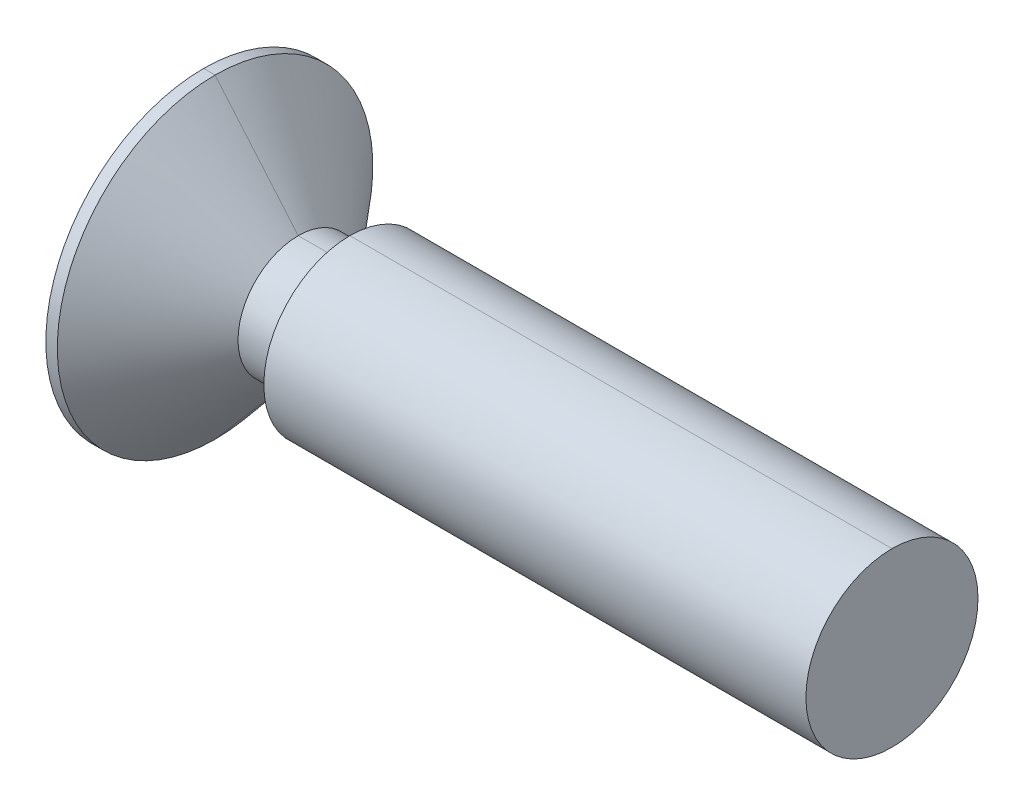
ISO-10303-21;
HEADER;
FILE_DESCRIPTION(('STEP AP214'),'2;1');
FILE_NAME('part.step','',(''),(''),'','','');
FILE_SCHEMA(('AUTOMOTIVE_DESIGN { 1 0 10303 214 1 1 1 1 }'));
ENDSEC;
DATA;
#1=APPLICATION_CONTEXT('core data for automotive mechanical design processes');
#2=APPLICATION_PROTOCOL_DEFINITION('international standard','automotive_design',2000,#1);
#3=PRODUCT_CONTEXT('',#1,'mechanical');
#4=PRODUCT('Part','Part','',(#3));
#5=PRODUCT_RELATED_PRODUCT_CATEGORY('part','',(#4));
#6=PRODUCT_DEFINITION_FORMATION('','',#4);
#7=PRODUCT_DEFINITION_CONTEXT('part definition',#1,'design');
#8=PRODUCT_DEFINITION('design','',#6,#7);
#9=PRODUCT_DEFINITION_SHAPE('','',#8);
#10=(LENGTH_UNIT() NAMED_UNIT(*) SI_UNIT(.MILLI.,.METRE.));
#11=(NAMED_UNIT(*) PLANE_ANGLE_UNIT() SI_UNIT($,.RADIAN.));
#12=(NAMED_UNIT(*) SI_UNIT($,.STERADIAN.) SOLID_ANGLE_UNIT());
#13=UNCERTAINTY_MEASURE_WITH_UNIT(LENGTH_MEASURE(1.E-05),#10,'distance_accuracy_value','');
#14=(GEOMETRIC_REPRESENTATION_CONTEXT(3) GLOBAL_UNCERTAINTY_ASSIGNED_CONTEXT((#13)) GLOBAL_UNIT_ASSIGNED_CONTEXT((#10,
#11,#12)) REPRESENTATION_CONTEXT('',''));
#15=CARTESIAN_POINT('',(0.,0.,0.));
#16=DIRECTION('',(0.,0.,1.));
#17=DIRECTION('',(1.,0.,0.));
#18=AXIS2_PLACEMENT_3D('',#15,#16,#17);
#19=CARTESIAN_POINT('',(-11.175,0.675,-0.675));
#20=DIRECTION('',(1.,0.,0.));
#21=DIRECTION('',(0.,1.,0.));
#22=AXIS2_PLACEMENT_3D('',#19,#20,#21);
#23=PLANE('',#22);
#24=DIRECTION('',(0.,-1.,0.));
#25=VECTOR('',#24,1.);
#26=CARTESIAN_POINT('',(-11.175,1.8,-0.375));
#27=LINE('',#26,#25);
#28=CARTESIAN_POINT('',(-11.175,1.8,-0.375));
#29=VERTEX_POINT('',#28);
#30=CARTESIAN_POINT('',(-11.175,0.675,-0.375));
#31=VERTEX_POINT('',#30);
#32=EDGE_CURVE('E304',#29,#31,#27,.T.);
#33=ORIENTED_EDGE('',*,*,#32,.T.);
#34=CARTESIAN_POINT('',(-11.175,0.675,-0.675));
#35=DIRECTION('',(1.,0.,0.));
#36=DIRECTION('',(0.,1.,0.));
#37=AXIS2_PLACEMENT_3D('',#34,#35,#36);
#38=CIRCLE('',#37,0.3);
#39=CARTESIAN_POINT('',(-11.175,0.375,-0.675));
#40=VERTEX_POINT('',#39);
#41=EDGE_CURVE('E10',#31,#40,#38,.T.);
#42=ORIENTED_EDGE('',*,*,#41,.T.);
#43=DIRECTION('',(0.,0.,-1.));
#44=VECTOR('',#43,1.);
#45=CARTESIAN_POINT('',(-11.175,0.375,-1.8));
#46=LINE('',#45,#44);
#47=CARTESIAN_POINT('',(-11.175,0.375,-1.8));
#48=VERTEX_POINT('',#47);
#49=EDGE_CURVE('E208',#40,#48,#46,.T.);
#50=ORIENTED_EDGE('',*,*,#49,.T.);
#51=DIRECTION('',(0.,-1.,0.));
#52=VECTOR('',#51,1.);
#53=CARTESIAN_POINT('',(-11.175,0.375,-1.8));
#54=LINE('',#53,#52);
#55=CARTESIAN_POINT('',(-11.175,-0.375,-1.8));
#56=VERTEX_POINT('',#55);
#57=EDGE_CURVE('E201',#48,#56,#54,.T.);
#58=ORIENTED_EDGE('',*,*,#57,.T.);
#59=DIRECTION('',(0.,0.,1.));
#60=VECTOR('',#59,1.);
#61=CARTESIAN_POINT('',(-11.175,-0.375,-1.8));
#62=LINE('',#61,#60);
#63=CARTESIAN_POINT('',(-11.175,-0.375,-0.675));
#64=VERTEX_POINT('',#63);
#65=EDGE_CURVE('E205',#56,#64,#62,.T.);
#66=ORIENTED_EDGE('',*,*,#65,.T.);
#67=CARTESIAN_POINT('',(-11.175,-0.675,-0.675));
#68=DIRECTION('',(1.,0.,0.));
#69=DIRECTION('',(0.,-1.,0.));
#70=AXIS2_PLACEMENT_3D('',#67,#68,#69);
#71=CIRCLE('',#70,0.3);
#72=CARTESIAN_POINT('',(-11.175,-0.675,-0.375));
#73=VERTEX_POINT('',#72);
#74=EDGE_CURVE('E234',#64,#73,#71,.T.);
#75=ORIENTED_EDGE('',*,*,#74,.T.);
#76=DIRECTION('',(0.,-1.,0.));
#77=VECTOR('',#76,1.);
#78=CARTESIAN_POINT('',(-11.175,-0.675,-0.375));
#79=LINE('',#78,#77);
#80=CARTESIAN_POINT('',(-11.175,-1.8,-0.375));
#81=VERTEX_POINT('',#80);
#82=EDGE_CURVE('E286',#73,#81,#79,.T.);
#83=ORIENTED_EDGE('',*,*,#82,.T.);
#84=DIRECTION('',(0.,0.,1.));
#85=VECTOR('',#84,1.);
#86=CARTESIAN_POINT('',(-11.175,-1.8,-0.375));
#87=LINE('',#86,#85);
#88=CARTESIAN_POINT('',(-11.175,-1.8,0.375));
#89=VERTEX_POINT('',#88);
#90=EDGE_CURVE('E287',#81,#89,#87,.T.);
#91=ORIENTED_EDGE('',*,*,#90,.T.);
#92=DIRECTION('',(0.,1.,0.));
#93=VECTOR('',#92,1.);
#94=CARTESIAN_POINT('',(-11.175,-0.675,0.375));
#95=LINE('',#94,#93);
#96=CARTESIAN_POINT('',(-11.175,-0.675,0.375));
#97=VERTEX_POINT('',#96);
#98=EDGE_CURVE('E279',#89,#97,#95,.T.);
#99=ORIENTED_EDGE('',*,*,#98,.T.);
#100=CARTESIAN_POINT('',(-11.175,-0.675,0.675));
#101=DIRECTION('',(1.,0.,0.));
#102=DIRECTION('',(0.,1.,0.));
#103=AXIS2_PLACEMENT_3D('',#100,#101,#102);
#104=CIRCLE('',#103,0.3);
#105=CARTESIAN_POINT('',(-11.175,-0.375,0.675));
#106=VERTEX_POINT('',#105);
#107=EDGE_CURVE('E266',#97,#106,#104,.T.);
#108=ORIENTED_EDGE('',*,*,#107,.T.);
#109=DIRECTION('',(0.,0.,1.));
#110=VECTOR('',#109,1.);
#111=CARTESIAN_POINT('',(-11.175,-0.375,0.675));
#112=LINE('',#111,#110);
#113=CARTESIAN_POINT('',(-11.175,-0.375,1.8));
#114=VERTEX_POINT('',#113);
#115=EDGE_CURVE('E383',#106,#114,#112,.T.);
#116=ORIENTED_EDGE('',*,*,#115,.T.);
#117=DIRECTION('',(0.,1.,0.));
#118=VECTOR('',#117,1.);
#119=CARTESIAN_POINT('',(-11.175,0.375,1.8));
#120=LINE('',#119,#118);
#121=CARTESIAN_POINT('',(-11.175,0.375,1.8));
#122=VERTEX_POINT('',#121);
#123=EDGE_CURVE('E299',#114,#122,#120,.T.);
#124=ORIENTED_EDGE('',*,*,#123,.T.);
#125=DIRECTION('',(0.,0.,-1.));
#126=VECTOR('',#125,1.);
#127=CARTESIAN_POINT('',(-11.175,0.375,0.675));
#128=LINE('',#127,#126);
#129=CARTESIAN_POINT('',(-11.175,0.375,0.675));
#130=VERTEX_POINT('',#129);
#131=EDGE_CURVE('E300',#122,#130,#128,.T.);
#132=ORIENTED_EDGE('',*,*,#131,.T.);
#133=CARTESIAN_POINT('',(-11.175,0.675,0.675));
#134=DIRECTION('',(1.,0.,0.));
#135=DIRECTION('',(0.,1.,0.));
#136=AXIS2_PLACEMENT_3D('',#133,#134,#135);
#137=CIRCLE('',#136,0.3);
#138=CARTESIAN_POINT('',(-11.175,0.675,0.375));
#139=VERTEX_POINT('',#138);
#140=EDGE_CURVE('E240',#130,#139,#137,.T.);
#141=ORIENTED_EDGE('',*,*,#140,.T.);
#142=DIRECTION('',(0.,1.,0.));
#143=VECTOR('',#142,1.);
#144=CARTESIAN_POINT('',(-11.175,1.8,0.375));
#145=LINE('',#144,#143);
#146=CARTESIAN_POINT('',(-11.175,1.8,0.375));
#147=VERTEX_POINT('',#146);
#148=EDGE_CURVE('E273',#139,#147,#145,.T.);
#149=ORIENTED_EDGE('',*,*,#148,.T.);
#150=DIRECTION('',(0.,0.,-1.));
#151=VECTOR('',#150,1.);
#152=CARTESIAN_POINT('',(-11.175,1.8,-0.375));
#153=LINE('',#152,#151);
#154=EDGE_CURVE('E274',#147,#29,#153,.T.);
#155=ORIENTED_EDGE('',*,*,#154,.T.);
#156=EDGE_LOOP('',(#33,#42,#50,#58,#66,#75,#83,#91,#99,#108,#116,#124,#132,#141,#149,#155));
#157=FACE_BOUND('',#156,.T.);
#158=ADVANCED_FACE('F16',(#157),#23,.F.);
#159=CARTESIAN_POINT('',(-11.175,0.675,-0.675));
#160=DIRECTION('',(-1.,0.,0.));
#161=DIRECTION('',(0.,-1.,0.));
#162=AXIS2_PLACEMENT_3D('',#159,#160,#161);
#163=CYLINDRICAL_SURFACE('',#162,0.3);
#164=CARTESIAN_POINT('',(-12.,0.675,-0.675));
#165=DIRECTION('',(1.,0.,0.));
#166=DIRECTION('',(0.,1.,0.));
#167=AXIS2_PLACEMENT_3D('',#164,#165,#166);
#168=CIRCLE('',#167,0.3);
#169=CARTESIAN_POINT('',(-12.,0.675,-0.375));
#170=VERTEX_POINT('',#169);
#171=CARTESIAN_POINT('',(-12.,0.375,-0.675));
#172=VERTEX_POINT('',#171);
#173=EDGE_CURVE('E294',#170,#172,#168,.T.);
#174=ORIENTED_EDGE('',*,*,#173,.T.);
#175=DIRECTION('',(-1.,0.,0.));
#176=VECTOR('',#175,1.);
#177=CARTESIAN_POINT('',(-11.175,0.375,-0.675));
#178=LINE('',#177,#176);
#179=EDGE_CURVE('E27',#40,#172,#178,.T.);
#180=ORIENTED_EDGE('',*,*,#179,.F.);
#181=ORIENTED_EDGE('',*,*,#41,.F.);
#182=DIRECTION('',(-1.,0.,0.));
#183=VECTOR('',#182,1.);
#184=CARTESIAN_POINT('',(-11.175,0.675,-0.375));
#185=LINE('',#184,#183);
#186=EDGE_CURVE('E307',#31,#170,#185,.T.);
#187=ORIENTED_EDGE('',*,*,#186,.T.);
#188=EDGE_LOOP('',(#174,#180,#181,#187));
#189=FACE_BOUND('',#188,.T.);
#190=ADVANCED_FACE('F661',(#189),#163,.T.);
#191=CARTESIAN_POINT('',(-11.175,0.375,-1.8));
#192=DIRECTION('',(0.,1.,0.));
#193=DIRECTION('',(1.,0.,0.));
#194=AXIS2_PLACEMENT_3D('',#191,#192,#193);
#195=PLANE('',#194);
#196=DIRECTION('',(0.,0.,-1.));
#197=VECTOR('',#196,1.);
#198=CARTESIAN_POINT('',(-12.,0.375,-1.8));
#199=LINE('',#198,#197);
#200=CARTESIAN_POINT('',(-12.,0.375,-1.8));
#201=VERTEX_POINT('',#200);
#202=EDGE_CURVE('E291',#172,#201,#199,.T.);
#203=ORIENTED_EDGE('',*,*,#202,.T.);
#204=DIRECTION('',(-1.,0.,0.));
#205=VECTOR('',#204,1.);
#206=CARTESIAN_POINT('',(-11.175,0.375,-1.8));
#207=LINE('',#206,#205);
#208=EDGE_CURVE('E212',#48,#201,#207,.T.);
#209=ORIENTED_EDGE('',*,*,#208,.F.);
#210=ORIENTED_EDGE('',*,*,#49,.F.);
#211=ORIENTED_EDGE('',*,*,#179,.T.);
#212=EDGE_LOOP('',(#203,#209,#210,#211));
#213=FACE_BOUND('',#212,.T.);
#214=ADVANCED_FACE('F704',(#213),#195,.F.);
#215=CARTESIAN_POINT('',(-11.175,0.375,-1.8));
#216=DIRECTION('',(0.,0.,-1.));
#217=DIRECTION('',(0.,-1.,0.));
#218=AXIS2_PLACEMENT_3D('',#215,#216,#217);
#219=PLANE('',#218);
#220=DIRECTION('',(0.,-1.,0.));
#221=VECTOR('',#220,1.);
#222=CARTESIAN_POINT('',(-12.,0.375,-1.8));
#223=LINE('',#222,#221);
#224=CARTESIAN_POINT('',(-12.,-0.375,-1.8));
#225=VERTEX_POINT('',#224);
#226=EDGE_CURVE('E219',#201,#225,#223,.T.);
#227=ORIENTED_EDGE('',*,*,#226,.T.);
#228=DIRECTION('',(-1.,0.,0.));
#229=VECTOR('',#228,1.);
#230=CARTESIAN_POINT('',(-11.175,-0.375,-1.8));
#231=LINE('',#230,#229);
#232=EDGE_CURVE('E213',#56,#225,#231,.T.);
#233=ORIENTED_EDGE('',*,*,#232,.F.);
#234=ORIENTED_EDGE('',*,*,#57,.F.);
#235=ORIENTED_EDGE('',*,*,#208,.T.);
#236=EDGE_LOOP('',(#227,#233,#234,#235));
#237=FACE_BOUND('',#236,.T.);
#238=ADVANCED_FACE('F217',(#237),#219,.F.);
#239=CARTESIAN_POINT('',(-11.175,-0.375,-1.8));
#240=DIRECTION('',(0.,-1.,0.));
#241=DIRECTION('',(0.,0.,-1.));
#242=AXIS2_PLACEMENT_3D('',#239,#240,#241);
#243=PLANE('',#242);
#244=DIRECTION('',(0.,0.,1.));
#245=VECTOR('',#244,1.);
#246=CARTESIAN_POINT('',(-12.,-0.375,-1.8));
#247=LINE('',#246,#245);
#248=CARTESIAN_POINT('',(-12.,-0.375,-0.675));
#249=VERTEX_POINT('',#248);
#250=EDGE_CURVE('E340',#225,#249,#247,.T.);
#251=ORIENTED_EDGE('',*,*,#250,.T.);
#252=DIRECTION('',(-1.,0.,0.));
#253=VECTOR('',#252,1.);
#254=CARTESIAN_POINT('',(-11.175,-0.375,-0.675));
#255=LINE('',#254,#253);
#256=EDGE_CURVE('E226',#64,#249,#255,.T.);
#257=ORIENTED_EDGE('',*,*,#256,.F.);
#258=ORIENTED_EDGE('',*,*,#65,.F.);
#259=ORIENTED_EDGE('',*,*,#232,.T.);
#260=EDGE_LOOP('',(#251,#257,#258,#259));
#261=FACE_BOUND('',#260,.T.);
#262=ADVANCED_FACE('F225',(#261),#243,.F.);
#263=CARTESIAN_POINT('',(-11.175,-0.675,-0.675));
#264=DIRECTION('',(-1.,0.,0.));
#265=DIRECTION('',(0.,-1.,0.));
#266=AXIS2_PLACEMENT_3D('',#263,#264,#265);
#267=CYLINDRICAL_SURFACE('',#266,0.3);
#268=CARTESIAN_POINT('',(-12.,-0.675,-0.675));
#269=DIRECTION('',(1.,0.,0.));
#270=DIRECTION('',(0.,-1.,0.));
#271=AXIS2_PLACEMENT_3D('',#268,#269,#270);
#272=CIRCLE('',#271,0.3);
#273=CARTESIAN_POINT('',(-12.,-0.675,-0.375));
#274=VERTEX_POINT('',#273);
#275=EDGE_CURVE('E337',#249,#274,#272,.T.);
#276=ORIENTED_EDGE('',*,*,#275,.T.);
#277=DIRECTION('',(-1.,0.,0.));
#278=VECTOR('',#277,1.);
#279=CARTESIAN_POINT('',(-11.175,-0.675,-0.375));
#280=LINE('',#279,#278);
#281=EDGE_CURVE('E290',#73,#274,#280,.T.);
#282=ORIENTED_EDGE('',*,*,#281,.F.);
#283=ORIENTED_EDGE('',*,*,#74,.F.);
#284=ORIENTED_EDGE('',*,*,#256,.T.);
#285=EDGE_LOOP('',(#276,#282,#283,#284));
#286=FACE_BOUND('',#285,.T.);
#287=ADVANCED_FACE('F625',(#286),#267,.T.);
#288=CARTESIAN_POINT('',(-11.175,-0.675,-0.375));
#289=DIRECTION('',(0.,0.,-1.));
#290=DIRECTION('',(0.,-1.,0.));
#291=AXIS2_PLACEMENT_3D('',#288,#289,#290);
#292=PLANE('',#291);
#293=DIRECTION('',(0.,-1.,0.));
#294=VECTOR('',#293,1.);
#295=CARTESIAN_POINT('',(-12.,-0.675,-0.375));
#296=LINE('',#295,#294);
#297=CARTESIAN_POINT('',(-12.,-1.8,-0.375));
#298=VERTEX_POINT('',#297);
#299=EDGE_CURVE('E341',#274,#298,#296,.T.);
#300=ORIENTED_EDGE('',*,*,#299,.T.);
#301=DIRECTION('',(-1.,0.,0.));
#302=VECTOR('',#301,1.);
#303=CARTESIAN_POINT('',(-11.175,-1.8,-0.375));
#304=LINE('',#303,#302);
#305=EDGE_CURVE('E283',#81,#298,#304,.T.);
#306=ORIENTED_EDGE('',*,*,#305,.F.);
#307=ORIENTED_EDGE('',*,*,#82,.F.);
#308=ORIENTED_EDGE('',*,*,#281,.T.);
#309=EDGE_LOOP('',(#300,#306,#307,#308));
#310=FACE_BOUND('',#309,.T.);
#311=ADVANCED_FACE('F620',(#310),#292,.F.);
#312=CARTESIAN_POINT('',(-11.175,-1.8,-0.375));
#313=DIRECTION('',(0.,-1.,0.));
#314=DIRECTION('',(0.,0.,-1.));
#315=AXIS2_PLACEMENT_3D('',#312,#313,#314);
#316=PLANE('',#315);
#317=DIRECTION('',(0.,0.,1.));
#318=VECTOR('',#317,1.);
#319=CARTESIAN_POINT('',(-12.,-1.8,-0.375));
#320=LINE('',#319,#318);
#321=CARTESIAN_POINT('',(-12.,-1.8,0.375));
#322=VERTEX_POINT('',#321);
#323=EDGE_CURVE('E352',#298,#322,#320,.T.);
#324=ORIENTED_EDGE('',*,*,#323,.T.);
#325=DIRECTION('',(-1.,0.,0.));
#326=VECTOR('',#325,1.);
#327=CARTESIAN_POINT('',(-11.175,-1.8,0.375));
#328=LINE('',#327,#326);
#329=EDGE_CURVE('E370',#89,#322,#328,.T.);
#330=ORIENTED_EDGE('',*,*,#329,.F.);
#331=ORIENTED_EDGE('',*,*,#90,.F.);
#332=ORIENTED_EDGE('',*,*,#305,.T.);
#333=EDGE_LOOP('',(#324,#330,#331,#332));
#334=FACE_BOUND('',#333,.T.);
#335=ADVANCED_FACE('F624',(#334),#316,.F.);
#336=CARTESIAN_POINT('',(-11.175,-0.675,0.375));
#337=DIRECTION('',(0.,0.,1.));
#338=DIRECTION('',(0.,-1.,0.));
#339=AXIS2_PLACEMENT_3D('',#336,#337,#338);
#340=PLANE('',#339);
#341=DIRECTION('',(0.,1.,0.));
#342=VECTOR('',#341,1.);
#343=CARTESIAN_POINT('',(-12.,-0.675,0.375));
#344=LINE('',#343,#342);
#345=CARTESIAN_POINT('',(-12.,-0.675,0.375));
#346=VERTEX_POINT('',#345);
#347=EDGE_CURVE('E363',#322,#346,#344,.T.);
#348=ORIENTED_EDGE('',*,*,#347,.T.);
#349=DIRECTION('',(-1.,0.,0.));
#350=VECTOR('',#349,1.);
#351=CARTESIAN_POINT('',(-11.175,-0.675,0.375));
#352=LINE('',#351,#350);
#353=EDGE_CURVE('E269',#97,#346,#352,.T.);
#354=ORIENTED_EDGE('',*,*,#353,.F.);
#355=ORIENTED_EDGE('',*,*,#98,.F.);
#356=ORIENTED_EDGE('',*,*,#329,.T.);
#357=EDGE_LOOP('',(#348,#354,#355,#356));
#358=FACE_BOUND('',#357,.T.);
#359=ADVANCED_FACE('F688',(#358),#340,.F.);
#360=CARTESIAN_POINT('',(-11.175,-0.675,0.675));
#361=DIRECTION('',(-1.,0.,0.));
#362=DIRECTION('',(0.,-1.,0.));
#363=AXIS2_PLACEMENT_3D('',#360,#361,#362);
#364=CYLINDRICAL_SURFACE('',#363,0.3);
#365=CARTESIAN_POINT('',(-12.,-0.675,0.675));
#366=DIRECTION('',(1.,0.,0.));
#367=DIRECTION('',(0.,1.,0.));
#368=AXIS2_PLACEMENT_3D('',#365,#366,#367);
#369=CIRCLE('',#368,0.3);
#370=CARTESIAN_POINT('',(-12.,-0.375,0.675));
#371=VERTEX_POINT('',#370);
#372=EDGE_CURVE('E372',#346,#371,#369,.T.);
#373=ORIENTED_EDGE('',*,*,#372,.T.);
#374=DIRECTION('',(-1.,0.,0.));
#375=VECTOR('',#374,1.);
#376=CARTESIAN_POINT('',(-11.175,-0.375,0.675));
#377=LINE('',#376,#375);
#378=EDGE_CURVE('E270',#106,#371,#377,.T.);
#379=ORIENTED_EDGE('',*,*,#378,.F.);
#380=ORIENTED_EDGE('',*,*,#107,.F.);
#381=ORIENTED_EDGE('',*,*,#353,.T.);
#382=EDGE_LOOP('',(#373,#379,#380,#381));
#383=FACE_BOUND('',#382,.T.);
#384=ADVANCED_FACE('F684',(#383),#364,.T.);
#385=CARTESIAN_POINT('',(-11.175,-0.375,0.675));
#386=DIRECTION('',(0.,-1.,0.));
#387=DIRECTION('',(0.,0.,-1.));
#388=AXIS2_PLACEMENT_3D('',#385,#386,#387);
#389=PLANE('',#388);
#390=DIRECTION('',(0.,0.,1.));
#391=VECTOR('',#390,1.);
#392=CARTESIAN_POINT('',(-12.,-0.375,0.675));
#393=LINE('',#392,#391);
#394=CARTESIAN_POINT('',(-12.,-0.375,1.8));
#395=VERTEX_POINT('',#394);
#396=EDGE_CURVE('E20',#371,#395,#393,.T.);
#397=ORIENTED_EDGE('',*,*,#396,.T.);
#398=DIRECTION('',(-1.,0.,0.));
#399=VECTOR('',#398,1.);
#400=CARTESIAN_POINT('',(-11.175,-0.375,1.8));
#401=LINE('',#400,#399);
#402=EDGE_CURVE('E386',#114,#395,#401,.T.);
#403=ORIENTED_EDGE('',*,*,#402,.F.);
#404=ORIENTED_EDGE('',*,*,#115,.F.);
#405=ORIENTED_EDGE('',*,*,#378,.T.);
#406=EDGE_LOOP('',(#397,#403,#404,#405));
#407=FACE_BOUND('',#406,.T.);
#408=ADVANCED_FACE('F18',(#407),#389,.F.);
#409=CARTESIAN_POINT('',(-11.175,0.375,1.8));
#410=DIRECTION('',(0.,0.,1.));
#411=DIRECTION('',(1.,0.,0.));
#412=AXIS2_PLACEMENT_3D('',#409,#410,#411);
#413=PLANE('',#412);
#414=DIRECTION('',(0.,1.,0.));
#415=VECTOR('',#414,1.);
#416=CARTESIAN_POINT('',(-12.,0.375,1.8));
#417=LINE('',#416,#415);
#418=CARTESIAN_POINT('',(-12.,0.375,1.8));
#419=VERTEX_POINT('',#418);
#420=EDGE_CURVE('E333',#395,#419,#417,.T.);
#421=ORIENTED_EDGE('',*,*,#420,.T.);
#422=DIRECTION('',(-1.,0.,0.));
#423=VECTOR('',#422,1.);
#424=CARTESIAN_POINT('',(-11.175,0.375,1.8));
#425=LINE('',#424,#423);
#426=EDGE_CURVE('E296',#122,#419,#425,.T.);
#427=ORIENTED_EDGE('',*,*,#426,.F.);
#428=ORIENTED_EDGE('',*,*,#123,.F.);
#429=ORIENTED_EDGE('',*,*,#402,.T.);
#430=EDGE_LOOP('',(#421,#427,#428,#429));
#431=FACE_BOUND('',#430,.T.);
#432=ADVANCED_FACE('F640',(#431),#413,.F.);
#433=CARTESIAN_POINT('',(-11.175,0.375,0.675));
#434=DIRECTION('',(0.,1.,0.));
#435=DIRECTION('',(0.,0.,-1.));
#436=AXIS2_PLACEMENT_3D('',#433,#434,#435);
#437=PLANE('',#436);
#438=DIRECTION('',(0.,0.,-1.));
#439=VECTOR('',#438,1.);
#440=CARTESIAN_POINT('',(-12.,0.375,0.675));
#441=LINE('',#440,#439);
#442=CARTESIAN_POINT('',(-12.,0.375,0.675));
#443=VERTEX_POINT('',#442);
#444=EDGE_CURVE('E336',#419,#443,#441,.T.);
#445=ORIENTED_EDGE('',*,*,#444,.T.);
#446=DIRECTION('',(-1.,0.,0.));
#447=VECTOR('',#446,1.);
#448=CARTESIAN_POINT('',(-11.175,0.375,0.675));
#449=LINE('',#448,#447);
#450=EDGE_CURVE('E244',#130,#443,#449,.T.);
#451=ORIENTED_EDGE('',*,*,#450,.F.);
#452=ORIENTED_EDGE('',*,*,#131,.F.);
#453=ORIENTED_EDGE('',*,*,#426,.T.);
#454=EDGE_LOOP('',(#445,#451,#452,#453));
#455=FACE_BOUND('',#454,.T.);
#456=ADVANCED_FACE('F644',(#455),#437,.F.);
#457=CARTESIAN_POINT('',(-11.175,0.675,0.675));
#458=DIRECTION('',(-1.,0.,0.));
#459=DIRECTION('',(0.,-1.,0.));
#460=AXIS2_PLACEMENT_3D('',#457,#458,#459);
#461=CYLINDRICAL_SURFACE('',#460,0.3);
#462=CARTESIAN_POINT('',(-12.,0.675,0.675));
#463=DIRECTION('',(1.,0.,0.));
#464=DIRECTION('',(0.,1.,0.));
#465=AXIS2_PLACEMENT_3D('',#462,#463,#464);
#466=CIRCLE('',#465,0.3);
#467=CARTESIAN_POINT('',(-12.,0.675,0.375));
#468=VERTEX_POINT('',#467);
#469=EDGE_CURVE('E382',#443,#468,#466,.T.);
#470=ORIENTED_EDGE('',*,*,#469,.T.);
#471=DIRECTION('',(-1.,0.,0.));
#472=VECTOR('',#471,1.);
#473=CARTESIAN_POINT('',(-11.175,0.675,0.375));
#474=LINE('',#473,#472);
#475=EDGE_CURVE('E186',#139,#468,#474,.T.);
#476=ORIENTED_EDGE('',*,*,#475,.F.);
#477=ORIENTED_EDGE('',*,*,#140,.F.);
#478=ORIENTED_EDGE('',*,*,#450,.T.);
#479=EDGE_LOOP('',(#470,#476,#477,#478));
#480=FACE_BOUND('',#479,.T.);
#481=ADVANCED_FACE('F729',(#480),#461,.T.);
#482=CARTESIAN_POINT('',(-11.175,1.8,0.375));
#483=DIRECTION('',(0.,0.,1.));
#484=DIRECTION('',(0.,-1.,0.));
#485=AXIS2_PLACEMENT_3D('',#482,#483,#484);
#486=PLANE('',#485);
#487=DIRECTION('',(0.,1.,0.));
#488=VECTOR('',#487,1.);
#489=CARTESIAN_POINT('',(-12.,1.8,0.375));
#490=LINE('',#489,#488);
#491=CARTESIAN_POINT('',(-12.,1.8,0.375));
#492=VERTEX_POINT('',#491);
#493=EDGE_CURVE('E410',#468,#492,#490,.T.);
#494=ORIENTED_EDGE('',*,*,#493,.T.);
#495=DIRECTION('',(-1.,0.,0.));
#496=VECTOR('',#495,1.);
#497=CARTESIAN_POINT('',(-11.175,1.8,0.375));
#498=LINE('',#497,#496);
#499=EDGE_CURVE('E174',#147,#492,#498,.T.);
#500=ORIENTED_EDGE('',*,*,#499,.F.);
#501=ORIENTED_EDGE('',*,*,#148,.F.);
#502=ORIENTED_EDGE('',*,*,#475,.T.);
#503=EDGE_LOOP('',(#494,#500,#501,#502));
#504=FACE_BOUND('',#503,.T.);
#505=ADVANCED_FACE('F635',(#504),#486,.F.);
#506=CARTESIAN_POINT('',(-11.175,1.8,-0.375));
#507=DIRECTION('',(0.,1.,0.));
#508=DIRECTION('',(0.,0.,-1.));
#509=AXIS2_PLACEMENT_3D('',#506,#507,#508);
#510=PLANE('',#509);
#511=DIRECTION('',(0.,0.,-1.));
#512=VECTOR('',#511,1.);
#513=CARTESIAN_POINT('',(-12.,1.8,-0.375));
#514=LINE('',#513,#512);
#515=CARTESIAN_POINT('',(-12.,1.8,-0.375));
#516=VERTEX_POINT('',#515);
#517=EDGE_CURVE('E429',#492,#516,#514,.T.);
#518=ORIENTED_EDGE('',*,*,#517,.T.);
#519=DIRECTION('',(-1.,0.,0.));
#520=VECTOR('',#519,1.);
#521=CARTESIAN_POINT('',(-11.175,1.8,-0.375));
#522=LINE('',#521,#520);
#523=EDGE_CURVE('E306',#29,#516,#522,.T.);
#524=ORIENTED_EDGE('',*,*,#523,.F.);
#525=ORIENTED_EDGE('',*,*,#154,.F.);
#526=ORIENTED_EDGE('',*,*,#499,.T.);
#527=EDGE_LOOP('',(#518,#524,#525,#526));
#528=FACE_BOUND('',#527,.T.);
#529=ADVANCED_FACE('F630',(#528),#510,.F.);
#530=CARTESIAN_POINT('',(-11.175,1.8,-0.375));
#531=DIRECTION('',(0.,0.,-1.));
#532=DIRECTION('',(0.,-1.,0.));
#533=AXIS2_PLACEMENT_3D('',#530,#531,#532);
#534=PLANE('',#533);
#535=DIRECTION('',(0.,-1.,0.));
#536=VECTOR('',#535,1.);
#537=CARTESIAN_POINT('',(-12.,1.8,-0.375));
#538=LINE('',#537,#536);
#539=EDGE_CURVE('E425',#516,#170,#538,.T.);
#540=ORIENTED_EDGE('',*,*,#539,.T.);
#541=ORIENTED_EDGE('',*,*,#186,.F.);
#542=ORIENTED_EDGE('',*,*,#32,.F.);
#543=ORIENTED_EDGE('',*,*,#523,.T.);
#544=EDGE_LOOP('',(#540,#541,#542,#543));
#545=FACE_BOUND('',#544,.T.);
#546=ADVANCED_FACE('F634',(#545),#534,.F.);
#547=CARTESIAN_POINT('',(-12.,2.75,0.));
#548=DIRECTION('',(-1.,0.,0.));
#549=DIRECTION('',(0.,1.,0.));
#550=AXIS2_PLACEMENT_3D('',#547,#548,#549);
#551=PLANE('',#550);
#552=ORIENTED_EDGE('',*,*,#539,.F.);
#553=ORIENTED_EDGE('',*,*,#517,.F.);
#554=ORIENTED_EDGE('',*,*,#493,.F.);
#555=ORIENTED_EDGE('',*,*,#469,.F.);
#556=ORIENTED_EDGE('',*,*,#444,.F.);
#557=ORIENTED_EDGE('',*,*,#420,.F.);
#558=ORIENTED_EDGE('',*,*,#396,.F.);
#559=ORIENTED_EDGE('',*,*,#372,.F.);
#560=ORIENTED_EDGE('',*,*,#347,.F.);
#561=ORIENTED_EDGE('',*,*,#323,.F.);
#562=ORIENTED_EDGE('',*,*,#299,.F.);
#563=ORIENTED_EDGE('',*,*,#275,.F.);
#564=ORIENTED_EDGE('',*,*,#250,.F.);
#565=ORIENTED_EDGE('',*,*,#226,.F.);
#566=ORIENTED_EDGE('',*,*,#202,.F.);
#567=ORIENTED_EDGE('',*,*,#173,.F.);
#568=EDGE_LOOP('',(#552,#553,#554,#555,#556,#557,#558,#559,#560,#561,#562,#563,#564,#565,#566,#567));
#569=FACE_BOUND('',#568,.T.);
#570=CARTESIAN_POINT('',(-12.,0.,0.));
#571=DIRECTION('',(1.,0.,0.));
#572=DIRECTION('',(0.,1.,0.));
#573=AXIS2_PLACEMENT_3D('',#570,#571,#572);
#574=CIRCLE('',#573,2.75);
#575=CARTESIAN_POINT('',(-12.,2.75,0.));
#576=VERTEX_POINT('',#575);
#577=CARTESIAN_POINT('',(-12.,-2.75,0.));
#578=VERTEX_POINT('',#577);
#579=EDGE_CURVE('E237',#576,#578,#574,.T.);
#580=ORIENTED_EDGE('',*,*,#579,.F.);
#581=CARTESIAN_POINT('',(-12.,0.,0.));
#582=DIRECTION('',(1.,0.,0.));
#583=DIRECTION('',(0.,1.,0.));
#584=AXIS2_PLACEMENT_3D('',#581,#582,#583);
#585=CIRCLE('',#584,2.75);
#586=EDGE_CURVE('E367',#578,#576,#585,.T.);
#587=ORIENTED_EDGE('',*,*,#586,.F.);
#588=EDGE_LOOP('',(#580,#587));
#589=FACE_BOUND('',#588,.T.);
#590=ADVANCED_FACE('F709',(#569,#589),#551,.T.);
#591=CARTESIAN_POINT('',(0.,0.,0.));
#592=DIRECTION('',(1.,0.,0.));
#593=DIRECTION('',(0.,1.,0.));
#594=AXIS2_PLACEMENT_3D('',#591,#592,#593);
#595=CYLINDRICAL_SURFACE('',#594,2.75);
#596=DIRECTION('',(1.,0.,0.));
#597=VECTOR('',#596,1.);
#598=CARTESIAN_POINT('',(0.,-2.75,0.));
#599=LINE('',#598,#597);
#600=CARTESIAN_POINT('',(-11.8,-2.75,0.));
#601=VERTEX_POINT('',#600);
#602=EDGE_CURVE('E251',#578,#601,#599,.T.);
#603=ORIENTED_EDGE('',*,*,#602,.F.);
#604=ORIENTED_EDGE('',*,*,#586,.T.);
#605=DIRECTION('',(1.,0.,0.));
#606=VECTOR('',#605,1.);
#607=CARTESIAN_POINT('',(0.,2.75,0.));
#608=LINE('',#607,#606);
#609=CARTESIAN_POINT('',(-11.8,2.75,0.));
#610=VERTEX_POINT('',#609);
#611=EDGE_CURVE('E265',#576,#610,#608,.T.);
#612=ORIENTED_EDGE('',*,*,#611,.T.);
#613=CARTESIAN_POINT('',(-11.8,0.,0.));
#614=DIRECTION('',(1.,0.,0.));
#615=DIRECTION('',(0.,1.,0.));
#616=AXIS2_PLACEMENT_3D('',#613,#614,#615);
#617=CIRCLE('',#616,2.75);
#618=EDGE_CURVE('E434',#601,#610,#617,.T.);
#619=ORIENTED_EDGE('',*,*,#618,.F.);
#620=EDGE_LOOP('',(#603,#604,#612,#619));
#621=FACE_BOUND('',#620,.T.);
#622=ADVANCED_FACE('F678',(#621),#595,.T.);
#623=CARTESIAN_POINT('',(-10.35,0.,0.));
#624=DIRECTION('',(-1.,0.,0.));
#625=DIRECTION('',(0.,-1.,0.));
#626=AXIS2_PLACEMENT_3D('',#623,#624,#625);
#627=CONICAL_SURFACE('',#626,1.05,0.8645972343669);
#628=DIRECTION('',(-0.64894660608275,0.760833951959086,0.));
#629=VECTOR('',#628,1.);
#630=CARTESIAN_POINT('',(-10.35,1.05,0.));
#631=LINE('',#630,#629);
#632=CARTESIAN_POINT('',(-10.35,1.05,0.));
#633=VERTEX_POINT('',#632);
#634=EDGE_CURVE('E407',#633,#610,#631,.T.);
#635=ORIENTED_EDGE('',*,*,#634,.F.);
#636=CARTESIAN_POINT('',(-10.35,0.,0.));
#637=DIRECTION('',(1.,0.,0.));
#638=DIRECTION('',(0.,1.,0.));
#639=AXIS2_PLACEMENT_3D('',#636,#637,#638);
#640=CIRCLE('',#639,1.05);
#641=CARTESIAN_POINT('',(-10.35,-1.05,0.));
#642=VERTEX_POINT('',#641);
#643=EDGE_CURVE('E416',#642,#633,#640,.T.);
#644=ORIENTED_EDGE('',*,*,#643,.F.);
#645=DIRECTION('',(-0.64894660608275,-0.760833951959086,0.));
#646=VECTOR('',#645,1.);
#647=CARTESIAN_POINT('',(-10.35,-1.05,0.));
#648=LINE('',#647,#646);
#649=EDGE_CURVE('E397',#642,#601,#648,.T.);
#650=ORIENTED_EDGE('',*,*,#649,.T.);
#651=ORIENTED_EDGE('',*,*,#618,.T.);
#652=EDGE_LOOP('',(#635,#644,#650,#651));
#653=FACE_BOUND('',#652,.T.);
#654=ADVANCED_FACE('F614',(#653),#627,.T.);
#655=CARTESIAN_POINT('',(0.,0.,0.));
#656=DIRECTION('',(1.,0.,0.));
#657=DIRECTION('',(0.,1.,0.));
#658=AXIS2_PLACEMENT_3D('',#655,#656,#657);
#659=CYLINDRICAL_SURFACE('',#658,1.05);
#660=DIRECTION('',(1.,0.,0.));
#661=VECTOR('',#660,1.);
#662=CARTESIAN_POINT('',(0.,-1.05,0.));
#663=LINE('',#662,#661);
#664=CARTESIAN_POINT('',(-9.45,-1.05,0.));
#665=VERTEX_POINT('',#664);
#666=EDGE_CURVE('E390',#642,#665,#663,.T.);
#667=ORIENTED_EDGE('',*,*,#666,.F.);
#668=ORIENTED_EDGE('',*,*,#643,.T.);
#669=DIRECTION('',(1.,0.,0.));
#670=VECTOR('',#669,1.);
#671=CARTESIAN_POINT('',(0.,1.05,0.));
#672=LINE('',#671,#670);
#673=CARTESIAN_POINT('',(-9.45,1.05,0.));
#674=VERTEX_POINT('',#673);
#675=EDGE_CURVE('E256',#633,#674,#672,.T.);
#676=ORIENTED_EDGE('',*,*,#675,.T.);
#677=CARTESIAN_POINT('',(-9.45,0.,0.));
#678=DIRECTION('',(1.,0.,0.));
#679=DIRECTION('',(0.,1.,0.));
#680=AXIS2_PLACEMENT_3D('',#677,#678,#679);
#681=CIRCLE('',#680,1.05);
#682=EDGE_CURVE('E249',#665,#674,#681,.T.);
#683=ORIENTED_EDGE('',*,*,#682,.F.);
#684=EDGE_LOOP('',(#667,#668,#676,#683));
#685=FACE_BOUND('',#684,.T.);
#686=ADVANCED_FACE('F609',(#685),#659,.T.);
#687=CARTESIAN_POINT('',(-9.45,1.5,0.));
#688=DIRECTION('',(-1.,0.,0.));
#689=DIRECTION('',(0.,1.,0.));
#690=AXIS2_PLACEMENT_3D('',#687,#688,#689);
#691=PLANE('',#690);
#692=CARTESIAN_POINT('',(-9.45,0.,0.));
#693=DIRECTION('',(1.,0.,0.));
#694=DIRECTION('',(0.,1.,0.));
#695=AXIS2_PLACEMENT_3D('',#692,#693,#694);
#696=CIRCLE('',#695,1.05);
#697=EDGE_CURVE('E261',#674,#665,#696,.T.);
#698=ORIENTED_EDGE('',*,*,#697,.T.);
#699=ORIENTED_EDGE('',*,*,#682,.T.);
#700=EDGE_LOOP('',(#698,#699));
#701=FACE_BOUND('',#700,.T.);
#702=CARTESIAN_POINT('',(-9.45,0.,0.));
#703=DIRECTION('',(1.,0.,0.));
#704=DIRECTION('',(0.,1.,0.));
#705=AXIS2_PLACEMENT_3D('',#702,#703,#704);
#706=CIRCLE('',#705,1.5);
#707=CARTESIAN_POINT('',(-9.45,1.5,0.));
#708=VERTEX_POINT('',#707);
#709=CARTESIAN_POINT('',(-9.45,-1.5,0.));
#710=VERTEX_POINT('',#709);
#711=EDGE_CURVE('E260',#708,#710,#706,.T.);
#712=ORIENTED_EDGE('',*,*,#711,.F.);
#713=CARTESIAN_POINT('',(-9.45,0.,0.));
#714=DIRECTION('',(1.,0.,0.));
#715=DIRECTION('',(0.,1.,0.));
#716=AXIS2_PLACEMENT_3D('',#713,#714,#715);
#717=CIRCLE('',#716,1.5);
#718=EDGE_CURVE('E245',#710,#708,#717,.T.);
#719=ORIENTED_EDGE('',*,*,#718,.F.);
#720=EDGE_LOOP('',(#712,#719));
#721=FACE_BOUND('',#720,.T.);
#722=ADVANCED_FACE('F613',(#701,#721),#691,.T.);
#723=CARTESIAN_POINT('',(0.,0.,0.));
#724=DIRECTION('',(1.,0.,0.));
#725=DIRECTION('',(0.,1.,0.));
#726=AXIS2_PLACEMENT_3D('',#723,#724,#725);
#727=CYLINDRICAL_SURFACE('',#726,1.5);
#728=DIRECTION('',(1.,0.,0.));
#729=VECTOR('',#728,1.);
#730=CARTESIAN_POINT('',(0.,-1.5,0.));
#731=LINE('',#730,#729);
#732=CARTESIAN_POINT('',(0.,-1.5,0.));
#733=VERTEX_POINT('',#732);
#734=EDGE_CURVE('E433',#710,#733,#731,.T.);
#735=ORIENTED_EDGE('',*,*,#734,.F.);
#736=ORIENTED_EDGE('',*,*,#718,.T.);
#737=DIRECTION('',(1.,0.,0.));
#738=VECTOR('',#737,1.);
#739=CARTESIAN_POINT('',(0.,1.5,0.));
#740=LINE('',#739,#738);
#741=CARTESIAN_POINT('',(0.,1.5,0.));
#742=VERTEX_POINT('',#741);
#743=EDGE_CURVE('E282',#708,#742,#740,.T.);
#744=ORIENTED_EDGE('',*,*,#743,.T.);
#745=CARTESIAN_POINT('',(0.,0.,0.));
#746=DIRECTION('',(1.,0.,0.));
#747=DIRECTION('',(0.,1.,0.));
#748=AXIS2_PLACEMENT_3D('',#745,#746,#747);
#749=CIRCLE('',#748,1.5);
#750=EDGE_CURVE('E250',#733,#742,#749,.T.);
#751=ORIENTED_EDGE('',*,*,#750,.F.);
#752=EDGE_LOOP('',(#735,#736,#744,#751));
#753=FACE_BOUND('',#752,.T.);
#754=ADVANCED_FACE('F653',(#753),#727,.T.);
#755=CARTESIAN_POINT('',(0.,0.,0.));
#756=DIRECTION('',(1.,0.,0.));
#757=DIRECTION('',(0.,1.,0.));
#758=AXIS2_PLACEMENT_3D('',#755,#756,#757);
#759=PLANE('',#758);
#760=CARTESIAN_POINT('',(0.,0.,0.));
#761=DIRECTION('',(1.,0.,0.));
#762=DIRECTION('',(0.,1.,0.));
#763=AXIS2_PLACEMENT_3D('',#760,#761,#762);
#764=CIRCLE('',#763,1.5);
#765=EDGE_CURVE('E424',#742,#733,#764,.T.);
#766=ORIENTED_EDGE('',*,*,#765,.T.);
#767=ORIENTED_EDGE('',*,*,#750,.T.);
#768=EDGE_LOOP('',(#766,#767));
#769=FACE_BOUND('',#768,.T.);
#770=ADVANCED_FACE('F669',(#769),#759,.T.);
#771=CARTESIAN_POINT('',(0.,0.,0.));
#772=DIRECTION('',(1.,0.,0.));
#773=DIRECTION('',(0.,1.,0.));
#774=AXIS2_PLACEMENT_3D('',#771,#772,#773);
#775=CYLINDRICAL_SURFACE('',#774,1.5);
#776=ORIENTED_EDGE('',*,*,#711,.T.);
#777=ORIENTED_EDGE('',*,*,#734,.T.);
#778=ORIENTED_EDGE('',*,*,#765,.F.);
#779=ORIENTED_EDGE('',*,*,#743,.F.);
#780=EDGE_LOOP('',(#776,#777,#778,#779));
#781=FACE_BOUND('',#780,.T.);
#782=ADVANCED_FACE('F595',(#781),#775,.T.);
#783=CARTESIAN_POINT('',(0.,0.,0.));
#784=DIRECTION('',(1.,0.,0.));
#785=DIRECTION('',(0.,1.,0.));
#786=AXIS2_PLACEMENT_3D('',#783,#784,#785);
#787=CYLINDRICAL_SURFACE('',#786,1.05);
#788=CARTESIAN_POINT('',(-10.35,0.,0.));
#789=DIRECTION('',(1.,0.,0.));
#790=DIRECTION('',(0.,1.,0.));
#791=AXIS2_PLACEMENT_3D('',#788,#789,#790);
#792=CIRCLE('',#791,1.05);
#793=EDGE_CURVE('E420',#633,#642,#792,.T.);
#794=ORIENTED_EDGE('',*,*,#793,.T.);
#795=ORIENTED_EDGE('',*,*,#666,.T.);
#796=ORIENTED_EDGE('',*,*,#697,.F.);
#797=ORIENTED_EDGE('',*,*,#675,.F.);
#798=EDGE_LOOP('',(#794,#795,#796,#797));
#799=FACE_BOUND('',#798,.T.);
#800=ADVANCED_FACE('F590',(#799),#787,.T.);
#801=CARTESIAN_POINT('',(-10.35,0.,0.));
#802=DIRECTION('',(-1.,0.,0.));
#803=DIRECTION('',(0.,-1.,0.));
#804=AXIS2_PLACEMENT_3D('',#801,#802,#803);
#805=CONICAL_SURFACE('',#804,1.05,0.8645972343669);
#806=ORIENTED_EDGE('',*,*,#793,.F.);
#807=ORIENTED_EDGE('',*,*,#634,.T.);
#808=CARTESIAN_POINT('',(-11.8,0.,0.));
#809=DIRECTION('',(1.,0.,0.));
#810=DIRECTION('',(0.,1.,0.));
#811=AXIS2_PLACEMENT_3D('',#808,#809,#810);
#812=CIRCLE('',#811,2.75);
#813=EDGE_CURVE('E255',#610,#601,#812,.T.);
#814=ORIENTED_EDGE('',*,*,#813,.T.);
#815=ORIENTED_EDGE('',*,*,#649,.F.);
#816=EDGE_LOOP('',(#806,#807,#814,#815));
#817=FACE_BOUND('',#816,.T.);
#818=ADVANCED_FACE('F594',(#817),#805,.T.);
#819=CARTESIAN_POINT('',(0.,0.,0.));
#820=DIRECTION('',(1.,0.,0.));
#821=DIRECTION('',(0.,1.,0.));
#822=AXIS2_PLACEMENT_3D('',#819,#820,#821);
#823=CYLINDRICAL_SURFACE('',#822,2.75);
#824=ORIENTED_EDGE('',*,*,#579,.T.);
#825=ORIENTED_EDGE('',*,*,#602,.T.);
#826=ORIENTED_EDGE('',*,*,#813,.F.);
#827=ORIENTED_EDGE('',*,*,#611,.F.);
#828=EDGE_LOOP('',(#824,#825,#826,#827));
#829=FACE_BOUND('',#828,.T.);
#830=ADVANCED_FACE('F600',(#829),#823,.T.);
#831=CLOSED_SHELL('',(#158,#190,#214,#238,#262,#287,#311,#335,#359,#384,#408,#432,#456,#481,
#505,#529,#546,#590,#622,#654,#686,#722,#754,#770,#782,#800,#818,#830));
#832=MANIFOLD_SOLID_BREP('B1',#831);
#833=ADVANCED_BREP_SHAPE_REPRESENTATION('',(#18,#832),#14);
#834=SHAPE_DEFINITION_REPRESENTATION(#9,#833);
ENDSEC;
END-ISO-10303-21;
